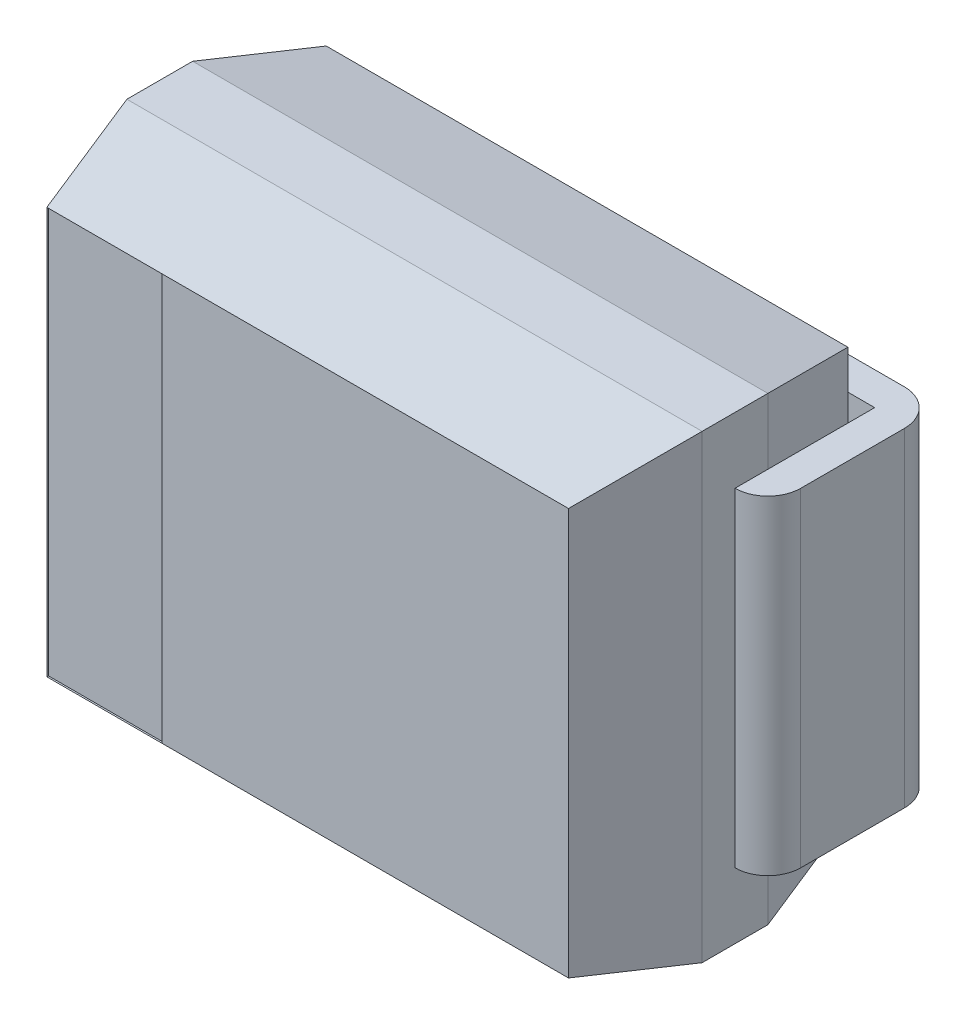
ISO-10303-21;
HEADER;
FILE_DESCRIPTION(('STEP AP214'),'2;1');
FILE_NAME('part.step','',(''),(''),'','','');
FILE_SCHEMA(('AUTOMOTIVE_DESIGN { 1 0 10303 214 1 1 1 1 }'));
ENDSEC;
DATA;
#1=APPLICATION_CONTEXT('core data for automotive mechanical design processes');
#2=APPLICATION_PROTOCOL_DEFINITION('international standard','automotive_design',2000,#1);
#3=PRODUCT_CONTEXT('',#1,'mechanical');
#4=PRODUCT('Part','Part','',(#3));
#5=PRODUCT_RELATED_PRODUCT_CATEGORY('part','',(#4));
#6=PRODUCT_DEFINITION_FORMATION('','',#4);
#7=PRODUCT_DEFINITION_CONTEXT('part definition',#1,'design');
#8=PRODUCT_DEFINITION('design','',#6,#7);
#9=PRODUCT_DEFINITION_SHAPE('','',#8);
#10=(LENGTH_UNIT() NAMED_UNIT(*) SI_UNIT(.MILLI.,.METRE.));
#11=(NAMED_UNIT(*) PLANE_ANGLE_UNIT() SI_UNIT($,.RADIAN.));
#12=(NAMED_UNIT(*) SI_UNIT($,.STERADIAN.) SOLID_ANGLE_UNIT());
#13=UNCERTAINTY_MEASURE_WITH_UNIT(LENGTH_MEASURE(1.E-05),#10,'distance_accuracy_value','');
#14=(GEOMETRIC_REPRESENTATION_CONTEXT(3) GLOBAL_UNCERTAINTY_ASSIGNED_CONTEXT((#13)) GLOBAL_UNIT_ASSIGNED_CONTEXT((#10,
#11,#12)) REPRESENTATION_CONTEXT('',''));
#15=CARTESIAN_POINT('',(0.,0.,0.));
#16=DIRECTION('',(0.,0.,1.));
#17=DIRECTION('',(1.,0.,0.));
#18=AXIS2_PLACEMENT_3D('',#15,#16,#17);
#19=CARTESIAN_POINT('',(0.815,-1.,0.));
#20=DIRECTION('',(-1.,0.,0.));
#21=DIRECTION('',(0.,0.,-1.));
#22=AXIS2_PLACEMENT_3D('',#19,#20,#21);
#23=PLANE('',#22);
#24=DIRECTION('',(0.,1.,0.));
#25=VECTOR('',#24,1.);
#26=CARTESIAN_POINT('',(0.815,-1.,0.));
#27=LINE('',#26,#25);
#28=CARTESIAN_POINT('',(0.815,-1.,0.));
#29=VERTEX_POINT('',#28);
#30=CARTESIAN_POINT('',(0.815,1.,0.));
#31=VERTEX_POINT('',#30);
#32=EDGE_CURVE('E51',#29,#31,#27,.T.);
#33=ORIENTED_EDGE('',*,*,#32,.F.);
#34=DIRECTION('',(0.,0.,-1.));
#35=VECTOR('',#34,1.);
#36=CARTESIAN_POINT('',(0.815,-1.,0.));
#37=LINE('',#36,#35);
#38=CARTESIAN_POINT('',(0.815,-1.,0.2));
#39=VERTEX_POINT('',#38);
#40=EDGE_CURVE('E164',#39,#29,#37,.T.);
#41=ORIENTED_EDGE('',*,*,#40,.F.);
#42=DIRECTION('',(0.,1.,0.));
#43=VECTOR('',#42,1.);
#44=CARTESIAN_POINT('',(0.815,-1.,0.2));
#45=LINE('',#44,#43);
#46=CARTESIAN_POINT('',(0.815,1.,0.2));
#47=VERTEX_POINT('',#46);
#48=EDGE_CURVE('E12',#39,#47,#45,.T.);
#49=ORIENTED_EDGE('',*,*,#48,.T.);
#50=DIRECTION('',(0.,0.,-1.));
#51=VECTOR('',#50,1.);
#52=CARTESIAN_POINT('',(0.815,1.,0.));
#53=LINE('',#52,#51);
#54=EDGE_CURVE('E112',#47,#31,#53,.T.);
#55=ORIENTED_EDGE('',*,*,#54,.T.);
#56=EDGE_LOOP('',(#33,#41,#49,#55));
#57=FACE_BOUND('',#56,.T.);
#58=ADVANCED_FACE('F48',(#57),#23,.T.);
#59=CARTESIAN_POINT('',(0.815,-1.,0.2));
#60=DIRECTION('',(0.,0.,1.));
#61=DIRECTION('',(-1.,0.,0.));
#62=AXIS2_PLACEMENT_3D('',#59,#60,#61);
#63=PLANE('',#62);
#64=ORIENTED_EDGE('',*,*,#48,.F.);
#65=DIRECTION('',(-1.,0.,0.));
#66=VECTOR('',#65,1.);
#67=CARTESIAN_POINT('',(0.815,-1.,0.2));
#68=LINE('',#67,#66);
#69=CARTESIAN_POINT('',(1.75,-1.,0.2));
#70=VERTEX_POINT('',#69);
#71=EDGE_CURVE('E64',#70,#39,#68,.T.);
#72=ORIENTED_EDGE('',*,*,#71,.F.);
#73=DIRECTION('',(0.,1.,0.));
#74=VECTOR('',#73,1.);
#75=CARTESIAN_POINT('',(1.75,-1.,0.2));
#76=LINE('',#75,#74);
#77=CARTESIAN_POINT('',(1.75,1.,0.2));
#78=VERTEX_POINT('',#77);
#79=EDGE_CURVE('E56',#70,#78,#76,.T.);
#80=ORIENTED_EDGE('',*,*,#79,.T.);
#81=DIRECTION('',(-1.,0.,0.));
#82=VECTOR('',#81,1.);
#83=CARTESIAN_POINT('',(0.815,1.,0.2));
#84=LINE('',#83,#82);
#85=EDGE_CURVE('E162',#78,#47,#84,.T.);
#86=ORIENTED_EDGE('',*,*,#85,.T.);
#87=EDGE_LOOP('',(#64,#72,#80,#86));
#88=FACE_BOUND('',#87,.T.);
#89=ADVANCED_FACE('F176',(#88),#63,.T.);
#90=CARTESIAN_POINT('',(1.75,-1.,0.2));
#91=DIRECTION('',(-1.,0.,0.));
#92=DIRECTION('',(0.,0.,-1.));
#93=AXIS2_PLACEMENT_3D('',#90,#91,#92);
#94=PLANE('',#93);
#95=ORIENTED_EDGE('',*,*,#79,.F.);
#96=DIRECTION('',(0.,0.,-1.));
#97=VECTOR('',#96,1.);
#98=CARTESIAN_POINT('',(1.75,-1.,0.850000000000009));
#99=LINE('',#98,#97);
#100=CARTESIAN_POINT('',(1.75,-1.,1.05000000000001));
#101=VERTEX_POINT('',#100);
#102=EDGE_CURVE('E69',#101,#70,#99,.T.);
#103=ORIENTED_EDGE('',*,*,#102,.F.);
#104=DIRECTION('',(0.,1.,0.));
#105=VECTOR('',#104,1.);
#106=CARTESIAN_POINT('',(1.75,-1.,1.05000000000001));
#107=LINE('',#106,#105);
#108=CARTESIAN_POINT('',(1.75,1.,1.05000000000001));
#109=VERTEX_POINT('',#108);
#110=EDGE_CURVE('E135',#101,#109,#107,.T.);
#111=ORIENTED_EDGE('',*,*,#110,.T.);
#112=DIRECTION('',(0.,0.,-1.));
#113=VECTOR('',#112,1.);
#114=CARTESIAN_POINT('',(1.75,1.,0.850000000000009));
#115=LINE('',#114,#113);
#116=EDGE_CURVE('E158',#109,#78,#115,.T.);
#117=ORIENTED_EDGE('',*,*,#116,.T.);
#118=EDGE_LOOP('',(#95,#103,#111,#117));
#119=FACE_BOUND('',#118,.T.);
#120=ADVANCED_FACE('F174',(#119),#94,.T.);
#121=CARTESIAN_POINT('',(1.75,-1.,0.850000000000009));
#122=DIRECTION('',(0.,1.,0.));
#123=DIRECTION('',(0.,0.,1.));
#124=AXIS2_PLACEMENT_3D('',#121,#122,#123);
#125=CYLINDRICAL_SURFACE('',#124,0.2);
#126=ORIENTED_EDGE('',*,*,#110,.F.);
#127=CARTESIAN_POINT('',(1.75,-1.,0.850000000000009));
#128=DIRECTION('',(0.,-1.,0.));
#129=DIRECTION('',(0.,0.,-1.));
#130=AXIS2_PLACEMENT_3D('',#127,#128,#129);
#131=CIRCLE('',#130,0.2);
#132=CARTESIAN_POINT('',(1.95,-1.,0.850000000000009));
#133=VERTEX_POINT('',#132);
#134=EDGE_CURVE('E129',#133,#101,#131,.T.);
#135=ORIENTED_EDGE('',*,*,#134,.F.);
#136=DIRECTION('',(0.,1.,0.));
#137=VECTOR('',#136,1.);
#138=CARTESIAN_POINT('',(1.95,-1.,0.850000000000009));
#139=LINE('',#138,#137);
#140=CARTESIAN_POINT('',(1.95,1.,0.850000000000009));
#141=VERTEX_POINT('',#140);
#142=EDGE_CURVE('E138',#133,#141,#139,.T.);
#143=ORIENTED_EDGE('',*,*,#142,.T.);
#144=CARTESIAN_POINT('',(1.75,1.,0.850000000000009));
#145=DIRECTION('',(0.,-1.,0.));
#146=DIRECTION('',(0.,0.,-1.));
#147=AXIS2_PLACEMENT_3D('',#144,#145,#146);
#148=CIRCLE('',#147,0.2);
#149=EDGE_CURVE('E156',#141,#109,#148,.T.);
#150=ORIENTED_EDGE('',*,*,#149,.T.);
#151=EDGE_LOOP('',(#126,#135,#143,#150));
#152=FACE_BOUND('',#151,.T.);
#153=ADVANCED_FACE('F172',(#152),#125,.T.);
#154=CARTESIAN_POINT('',(1.95,-1.,0.850000000000009));
#155=DIRECTION('',(1.,0.,0.));
#156=DIRECTION('',(0.,0.,1.));
#157=AXIS2_PLACEMENT_3D('',#154,#155,#156);
#158=PLANE('',#157);
#159=ORIENTED_EDGE('',*,*,#142,.F.);
#160=DIRECTION('',(0.,0.,1.));
#161=VECTOR('',#160,1.);
#162=CARTESIAN_POINT('',(1.95,-1.,0.850000000000009));
#163=LINE('',#162,#161);
#164=CARTESIAN_POINT('',(1.95,-1.,0.22));
#165=VERTEX_POINT('',#164);
#166=EDGE_CURVE('E149',#165,#133,#163,.T.);
#167=ORIENTED_EDGE('',*,*,#166,.F.);
#168=DIRECTION('',(0.,1.,0.));
#169=VECTOR('',#168,1.);
#170=CARTESIAN_POINT('',(1.95,-1.,0.22));
#171=LINE('',#170,#169);
#172=CARTESIAN_POINT('',(1.95,1.,0.22));
#173=VERTEX_POINT('',#172);
#174=EDGE_CURVE('E127',#165,#173,#171,.T.);
#175=ORIENTED_EDGE('',*,*,#174,.T.);
#176=DIRECTION('',(0.,0.,1.));
#177=VECTOR('',#176,1.);
#178=CARTESIAN_POINT('',(1.95,1.,0.850000000000009));
#179=LINE('',#178,#177);
#180=EDGE_CURVE('E147',#173,#141,#179,.T.);
#181=ORIENTED_EDGE('',*,*,#180,.T.);
#182=EDGE_LOOP('',(#159,#167,#175,#181));
#183=FACE_BOUND('',#182,.T.);
#184=ADVANCED_FACE('F146',(#183),#158,.T.);
#185=CARTESIAN_POINT('',(1.73,-1.,0.22));
#186=DIRECTION('',(0.,1.,0.));
#187=DIRECTION('',(0.,0.,1.));
#188=AXIS2_PLACEMENT_3D('',#185,#186,#187);
#189=CYLINDRICAL_SURFACE('',#188,0.22);
#190=ORIENTED_EDGE('',*,*,#174,.F.);
#191=CARTESIAN_POINT('',(1.73,-1.,0.22));
#192=DIRECTION('',(0.,-1.,0.));
#193=DIRECTION('',(0.,0.,1.));
#194=AXIS2_PLACEMENT_3D('',#191,#192,#193);
#195=CIRCLE('',#194,0.22);
#196=CARTESIAN_POINT('',(1.73,-1.,0.));
#197=VERTEX_POINT('',#196);
#198=EDGE_CURVE('E153',#197,#165,#195,.T.);
#199=ORIENTED_EDGE('',*,*,#198,.F.);
#200=DIRECTION('',(0.,1.,0.));
#201=VECTOR('',#200,1.);
#202=CARTESIAN_POINT('',(1.73,-1.,0.));
#203=LINE('',#202,#201);
#204=CARTESIAN_POINT('',(1.73,1.,0.));
#205=VERTEX_POINT('',#204);
#206=EDGE_CURVE('E126',#197,#205,#203,.T.);
#207=ORIENTED_EDGE('',*,*,#206,.T.);
#208=CARTESIAN_POINT('',(1.73,1.,0.22));
#209=DIRECTION('',(0.,-1.,0.));
#210=DIRECTION('',(0.,0.,1.));
#211=AXIS2_PLACEMENT_3D('',#208,#209,#210);
#212=CIRCLE('',#211,0.22);
#213=EDGE_CURVE('E114',#205,#173,#212,.T.);
#214=ORIENTED_EDGE('',*,*,#213,.T.);
#215=EDGE_LOOP('',(#190,#199,#207,#214));
#216=FACE_BOUND('',#215,.T.);
#217=ADVANCED_FACE('F152',(#216),#189,.T.);
#218=CARTESIAN_POINT('',(0.815,-1.,0.));
#219=DIRECTION('',(0.,0.,-1.));
#220=DIRECTION('',(1.,0.,0.));
#221=AXIS2_PLACEMENT_3D('',#218,#219,#220);
#222=PLANE('',#221);
#223=ORIENTED_EDGE('',*,*,#206,.F.);
#224=DIRECTION('',(1.,0.,0.));
#225=VECTOR('',#224,1.);
#226=CARTESIAN_POINT('',(0.815,-1.,0.));
#227=LINE('',#226,#225);
#228=EDGE_CURVE('E125',#29,#197,#227,.T.);
#229=ORIENTED_EDGE('',*,*,#228,.F.);
#230=ORIENTED_EDGE('',*,*,#32,.T.);
#231=DIRECTION('',(1.,0.,0.));
#232=VECTOR('',#231,1.);
#233=CARTESIAN_POINT('',(0.815,1.,0.));
#234=LINE('',#233,#232);
#235=EDGE_CURVE('E108',#31,#205,#234,.T.);
#236=ORIENTED_EDGE('',*,*,#235,.T.);
#237=EDGE_LOOP('',(#223,#229,#230,#236));
#238=FACE_BOUND('',#237,.T.);
#239=ADVANCED_FACE('F124',(#238),#222,.T.);
#240=CARTESIAN_POINT('',(1.75,-1.,0.850000000000009));
#241=DIRECTION('',(0.,-1.,0.));
#242=DIRECTION('',(0.,0.,-1.));
#243=AXIS2_PLACEMENT_3D('',#240,#241,#242);
#244=PLANE('',#243);
#245=ORIENTED_EDGE('',*,*,#40,.T.);
#246=ORIENTED_EDGE('',*,*,#228,.T.);
#247=ORIENTED_EDGE('',*,*,#198,.T.);
#248=ORIENTED_EDGE('',*,*,#166,.T.);
#249=ORIENTED_EDGE('',*,*,#134,.T.);
#250=ORIENTED_EDGE('',*,*,#102,.T.);
#251=ORIENTED_EDGE('',*,*,#71,.T.);
#252=EDGE_LOOP('',(#245,#246,#247,#248,#249,#250,#251));
#253=FACE_BOUND('',#252,.T.);
#254=ADVANCED_FACE('F170',(#253),#244,.T.);
#255=CARTESIAN_POINT('',(1.75,1.,0.850000000000009));
#256=DIRECTION('',(0.,-1.,0.));
#257=DIRECTION('',(0.,0.,-1.));
#258=AXIS2_PLACEMENT_3D('',#255,#256,#257);
#259=PLANE('',#258);
#260=ORIENTED_EDGE('',*,*,#54,.F.);
#261=ORIENTED_EDGE('',*,*,#85,.F.);
#262=ORIENTED_EDGE('',*,*,#116,.F.);
#263=ORIENTED_EDGE('',*,*,#149,.F.);
#264=ORIENTED_EDGE('',*,*,#180,.F.);
#265=ORIENTED_EDGE('',*,*,#213,.F.);
#266=ORIENTED_EDGE('',*,*,#235,.F.);
#267=EDGE_LOOP('',(#260,#261,#262,#263,#264,#265,#266));
#268=FACE_BOUND('',#267,.T.);
#269=ADVANCED_FACE('F110',(#268),#259,.F.);
#270=CLOSED_SHELL('',(#58,#89,#120,#153,#184,#217,#239,#254,#269));
#271=MANIFOLD_SOLID_BREP('B2',#270);
#272=CARTESIAN_POINT('',(-0.815,-1.,0.));
#273=DIRECTION('',(1.,0.,0.));
#274=DIRECTION('',(0.,0.,-1.));
#275=AXIS2_PLACEMENT_3D('',#272,#273,#274);
#276=PLANE('',#275);
#277=DIRECTION('',(0.,1.,0.));
#278=VECTOR('',#277,1.);
#279=CARTESIAN_POINT('',(-0.815,-1.,0.));
#280=LINE('',#279,#278);
#281=CARTESIAN_POINT('',(-0.815,-1.,0.));
#282=VERTEX_POINT('',#281);
#283=CARTESIAN_POINT('',(-0.815,1.,0.));
#284=VERTEX_POINT('',#283);
#285=EDGE_CURVE('E283',#282,#284,#280,.T.);
#286=ORIENTED_EDGE('',*,*,#285,.T.);
#287=DIRECTION('',(0.,0.,-1.));
#288=VECTOR('',#287,1.);
#289=CARTESIAN_POINT('',(-0.815,1.,0.));
#290=LINE('',#289,#288);
#291=CARTESIAN_POINT('',(-0.815,1.,0.2));
#292=VERTEX_POINT('',#291);
#293=EDGE_CURVE('E338',#292,#284,#290,.T.);
#294=ORIENTED_EDGE('',*,*,#293,.F.);
#295=DIRECTION('',(0.,1.,0.));
#296=VECTOR('',#295,1.);
#297=CARTESIAN_POINT('',(-0.815,-1.,0.2));
#298=LINE('',#297,#296);
#299=CARTESIAN_POINT('',(-0.815,-1.,0.2));
#300=VERTEX_POINT('',#299);
#301=EDGE_CURVE('E46',#300,#292,#298,.T.);
#302=ORIENTED_EDGE('',*,*,#301,.F.);
#303=DIRECTION('',(0.,0.,-1.));
#304=VECTOR('',#303,1.);
#305=CARTESIAN_POINT('',(-0.815,-1.,0.));
#306=LINE('',#305,#304);
#307=EDGE_CURVE('E339',#300,#282,#306,.T.);
#308=ORIENTED_EDGE('',*,*,#307,.T.);
#309=EDGE_LOOP('',(#286,#294,#302,#308));
#310=FACE_BOUND('',#309,.T.);
#311=ADVANCED_FACE('F280',(#310),#276,.T.);
#312=CARTESIAN_POINT('',(-0.815,-1.,0.2));
#313=DIRECTION('',(0.,0.,1.));
#314=DIRECTION('',(1.,0.,0.));
#315=AXIS2_PLACEMENT_3D('',#312,#313,#314);
#316=PLANE('',#315);
#317=ORIENTED_EDGE('',*,*,#301,.T.);
#318=DIRECTION('',(1.,0.,0.));
#319=VECTOR('',#318,1.);
#320=CARTESIAN_POINT('',(-0.815,1.,0.2));
#321=LINE('',#320,#319);
#322=CARTESIAN_POINT('',(-1.75,1.,0.2));
#323=VERTEX_POINT('',#322);
#324=EDGE_CURVE('E357',#323,#292,#321,.T.);
#325=ORIENTED_EDGE('',*,*,#324,.F.);
#326=DIRECTION('',(0.,1.,0.));
#327=VECTOR('',#326,1.);
#328=CARTESIAN_POINT('',(-1.75,-1.,0.2));
#329=LINE('',#328,#327);
#330=CARTESIAN_POINT('',(-1.75,-1.,0.2));
#331=VERTEX_POINT('',#330);
#332=EDGE_CURVE('E288',#331,#323,#329,.T.);
#333=ORIENTED_EDGE('',*,*,#332,.F.);
#334=DIRECTION('',(1.,0.,0.));
#335=VECTOR('',#334,1.);
#336=CARTESIAN_POINT('',(-0.815,-1.,0.2));
#337=LINE('',#336,#335);
#338=EDGE_CURVE('E344',#331,#300,#337,.T.);
#339=ORIENTED_EDGE('',*,*,#338,.T.);
#340=EDGE_LOOP('',(#317,#325,#333,#339));
#341=FACE_BOUND('',#340,.T.);
#342=ADVANCED_FACE('F406',(#341),#316,.T.);
#343=CARTESIAN_POINT('',(-1.75,-1.,0.2));
#344=DIRECTION('',(1.,0.,0.));
#345=DIRECTION('',(0.,0.,-1.));
#346=AXIS2_PLACEMENT_3D('',#343,#344,#345);
#347=PLANE('',#346);
#348=ORIENTED_EDGE('',*,*,#332,.T.);
#349=DIRECTION('',(0.,0.,-1.));
#350=VECTOR('',#349,1.);
#351=CARTESIAN_POINT('',(-1.75,1.,0.850000000000009));
#352=LINE('',#351,#350);
#353=CARTESIAN_POINT('',(-1.75,1.,1.05000000000001));
#354=VERTEX_POINT('',#353);
#355=EDGE_CURVE('E367',#354,#323,#352,.T.);
#356=ORIENTED_EDGE('',*,*,#355,.F.);
#357=DIRECTION('',(0.,1.,0.));
#358=VECTOR('',#357,1.);
#359=CARTESIAN_POINT('',(-1.75,-1.,1.05000000000001));
#360=LINE('',#359,#358);
#361=CARTESIAN_POINT('',(-1.75,-1.,1.05000000000001));
#362=VERTEX_POINT('',#361);
#363=EDGE_CURVE('E386',#362,#354,#360,.T.);
#364=ORIENTED_EDGE('',*,*,#363,.F.);
#365=DIRECTION('',(0.,0.,-1.));
#366=VECTOR('',#365,1.);
#367=CARTESIAN_POINT('',(-1.75,-1.,0.850000000000009));
#368=LINE('',#367,#366);
#369=EDGE_CURVE('E302',#362,#331,#368,.T.);
#370=ORIENTED_EDGE('',*,*,#369,.T.);
#371=EDGE_LOOP('',(#348,#356,#364,#370));
#372=FACE_BOUND('',#371,.T.);
#373=ADVANCED_FACE('F408',(#372),#347,.T.);
#374=CARTESIAN_POINT('',(-1.75,-1.,0.850000000000009));
#375=DIRECTION('',(0.,1.,0.));
#376=DIRECTION('',(0.,0.,1.));
#377=AXIS2_PLACEMENT_3D('',#374,#375,#376);
#378=CYLINDRICAL_SURFACE('',#377,0.2);
#379=ORIENTED_EDGE('',*,*,#363,.T.);
#380=CARTESIAN_POINT('',(-1.75,1.,0.850000000000009));
#381=DIRECTION('',(0.,1.,0.));
#382=DIRECTION('',(0.,0.,-1.));
#383=AXIS2_PLACEMENT_3D('',#380,#381,#382);
#384=CIRCLE('',#383,0.2);
#385=CARTESIAN_POINT('',(-1.95,1.,0.850000000000009));
#386=VERTEX_POINT('',#385);
#387=EDGE_CURVE('E364',#386,#354,#384,.T.);
#388=ORIENTED_EDGE('',*,*,#387,.F.);
#389=DIRECTION('',(0.,1.,0.));
#390=VECTOR('',#389,1.);
#391=CARTESIAN_POINT('',(-1.95,-1.,0.850000000000009));
#392=LINE('',#391,#390);
#393=CARTESIAN_POINT('',(-1.95,-1.,0.850000000000009));
#394=VERTEX_POINT('',#393);
#395=EDGE_CURVE('E388',#394,#386,#392,.T.);
#396=ORIENTED_EDGE('',*,*,#395,.F.);
#397=CARTESIAN_POINT('',(-1.75,-1.,0.850000000000009));
#398=DIRECTION('',(0.,1.,0.));
#399=DIRECTION('',(0.,0.,-1.));
#400=AXIS2_PLACEMENT_3D('',#397,#398,#399);
#401=CIRCLE('',#400,0.2);
#402=EDGE_CURVE('E379',#394,#362,#401,.T.);
#403=ORIENTED_EDGE('',*,*,#402,.T.);
#404=EDGE_LOOP('',(#379,#388,#396,#403));
#405=FACE_BOUND('',#404,.T.);
#406=ADVANCED_FACE('F401',(#405),#378,.T.);
#407=CARTESIAN_POINT('',(-1.95,-1.,0.850000000000009));
#408=DIRECTION('',(-1.,0.,0.));
#409=DIRECTION('',(0.,0.,1.));
#410=AXIS2_PLACEMENT_3D('',#407,#408,#409);
#411=PLANE('',#410);
#412=ORIENTED_EDGE('',*,*,#395,.T.);
#413=DIRECTION('',(0.,0.,1.));
#414=VECTOR('',#413,1.);
#415=CARTESIAN_POINT('',(-1.95,1.,0.850000000000009));
#416=LINE('',#415,#414);
#417=CARTESIAN_POINT('',(-1.95,1.,0.22));
#418=VERTEX_POINT('',#417);
#419=EDGE_CURVE('E361',#418,#386,#416,.T.);
#420=ORIENTED_EDGE('',*,*,#419,.F.);
#421=DIRECTION('',(0.,1.,0.));
#422=VECTOR('',#421,1.);
#423=CARTESIAN_POINT('',(-1.95,-1.,0.22));
#424=LINE('',#423,#422);
#425=CARTESIAN_POINT('',(-1.95,-1.,0.22));
#426=VERTEX_POINT('',#425);
#427=EDGE_CURVE('E390',#426,#418,#424,.T.);
#428=ORIENTED_EDGE('',*,*,#427,.F.);
#429=DIRECTION('',(0.,0.,1.));
#430=VECTOR('',#429,1.);
#431=CARTESIAN_POINT('',(-1.95,-1.,0.850000000000009));
#432=LINE('',#431,#430);
#433=EDGE_CURVE('E376',#426,#394,#432,.T.);
#434=ORIENTED_EDGE('',*,*,#433,.T.);
#435=EDGE_LOOP('',(#412,#420,#428,#434));
#436=FACE_BOUND('',#435,.T.);
#437=ADVANCED_FACE('F398',(#436),#411,.T.);
#438=CARTESIAN_POINT('',(-1.73,-1.,0.22));
#439=DIRECTION('',(0.,1.,0.));
#440=DIRECTION('',(0.,0.,1.));
#441=AXIS2_PLACEMENT_3D('',#438,#439,#440);
#442=CYLINDRICAL_SURFACE('',#441,0.22);
#443=ORIENTED_EDGE('',*,*,#427,.T.);
#444=CARTESIAN_POINT('',(-1.73,1.,0.22));
#445=DIRECTION('',(0.,1.,0.));
#446=DIRECTION('',(0.,0.,1.));
#447=AXIS2_PLACEMENT_3D('',#444,#445,#446);
#448=CIRCLE('',#447,0.22);
#449=CARTESIAN_POINT('',(-1.73,1.,0.));
#450=VERTEX_POINT('',#449);
#451=EDGE_CURVE('E351',#450,#418,#448,.T.);
#452=ORIENTED_EDGE('',*,*,#451,.F.);
#453=DIRECTION('',(0.,1.,0.));
#454=VECTOR('',#453,1.);
#455=CARTESIAN_POINT('',(-1.73,-1.,0.));
#456=LINE('',#455,#454);
#457=CARTESIAN_POINT('',(-1.73,-1.,0.));
#458=VERTEX_POINT('',#457);
#459=EDGE_CURVE('E343',#458,#450,#456,.T.);
#460=ORIENTED_EDGE('',*,*,#459,.F.);
#461=CARTESIAN_POINT('',(-1.73,-1.,0.22));
#462=DIRECTION('',(0.,1.,0.));
#463=DIRECTION('',(0.,0.,1.));
#464=AXIS2_PLACEMENT_3D('',#461,#462,#463);
#465=CIRCLE('',#464,0.22);
#466=EDGE_CURVE('E373',#458,#426,#465,.T.);
#467=ORIENTED_EDGE('',*,*,#466,.T.);
#468=EDGE_LOOP('',(#443,#452,#460,#467));
#469=FACE_BOUND('',#468,.T.);
#470=ADVANCED_FACE('F392',(#469),#442,.T.);
#471=CARTESIAN_POINT('',(-0.815,-1.,0.));
#472=DIRECTION('',(0.,0.,-1.));
#473=DIRECTION('',(-1.,0.,0.));
#474=AXIS2_PLACEMENT_3D('',#471,#472,#473);
#475=PLANE('',#474);
#476=ORIENTED_EDGE('',*,*,#459,.T.);
#477=DIRECTION('',(-1.,0.,0.));
#478=VECTOR('',#477,1.);
#479=CARTESIAN_POINT('',(-0.815,1.,0.));
#480=LINE('',#479,#478);
#481=EDGE_CURVE('E346',#284,#450,#480,.T.);
#482=ORIENTED_EDGE('',*,*,#481,.F.);
#483=ORIENTED_EDGE('',*,*,#285,.F.);
#484=DIRECTION('',(-1.,0.,0.));
#485=VECTOR('',#484,1.);
#486=CARTESIAN_POINT('',(-0.815,-1.,0.));
#487=LINE('',#486,#485);
#488=EDGE_CURVE('E371',#282,#458,#487,.T.);
#489=ORIENTED_EDGE('',*,*,#488,.T.);
#490=EDGE_LOOP('',(#476,#482,#483,#489));
#491=FACE_BOUND('',#490,.T.);
#492=ADVANCED_FACE('F347',(#491),#475,.T.);
#493=CARTESIAN_POINT('',(-1.75,-1.,0.850000000000009));
#494=DIRECTION('',(0.,-1.,0.));
#495=DIRECTION('',(0.,0.,-1.));
#496=AXIS2_PLACEMENT_3D('',#493,#494,#495);
#497=PLANE('',#496);
#498=ORIENTED_EDGE('',*,*,#307,.F.);
#499=ORIENTED_EDGE('',*,*,#338,.F.);
#500=ORIENTED_EDGE('',*,*,#369,.F.);
#501=ORIENTED_EDGE('',*,*,#402,.F.);
#502=ORIENTED_EDGE('',*,*,#433,.F.);
#503=ORIENTED_EDGE('',*,*,#466,.F.);
#504=ORIENTED_EDGE('',*,*,#488,.F.);
#505=EDGE_LOOP('',(#498,#499,#500,#501,#502,#503,#504));
#506=FACE_BOUND('',#505,.T.);
#507=ADVANCED_FACE('F403',(#506),#497,.T.);
#508=CARTESIAN_POINT('',(-1.75,1.,0.850000000000009));
#509=DIRECTION('',(0.,-1.,0.));
#510=DIRECTION('',(0.,0.,-1.));
#511=AXIS2_PLACEMENT_3D('',#508,#509,#510);
#512=PLANE('',#511);
#513=ORIENTED_EDGE('',*,*,#293,.T.);
#514=ORIENTED_EDGE('',*,*,#481,.T.);
#515=ORIENTED_EDGE('',*,*,#451,.T.);
#516=ORIENTED_EDGE('',*,*,#419,.T.);
#517=ORIENTED_EDGE('',*,*,#387,.T.);
#518=ORIENTED_EDGE('',*,*,#355,.T.);
#519=ORIENTED_EDGE('',*,*,#324,.T.);
#520=EDGE_LOOP('',(#513,#514,#515,#516,#517,#518,#519));
#521=FACE_BOUND('',#520,.T.);
#522=ADVANCED_FACE('F354',(#521),#512,.F.);
#523=CLOSED_SHELL('',(#311,#342,#373,#406,#437,#470,#492,#507,#522));
#524=MANIFOLD_SOLID_BREP('B6',#523);
#525=CARTESIAN_POINT('',(1.75,1.4,1.9));
#526=DIRECTION('',(-1.,0.,0.));
#527=DIRECTION('',(0.,-1.,0.));
#528=AXIS2_PLACEMENT_3D('',#525,#526,#527);
#529=PLANE('',#528);
#530=DIRECTION('',(0.,0.,-1.));
#531=VECTOR('',#530,1.);
#532=CARTESIAN_POINT('',(1.75,-1.4,1.9));
#533=LINE('',#532,#531);
#534=CARTESIAN_POINT('',(1.75,-1.4,1.24999999999999));
#535=VERTEX_POINT('',#534);
#536=CARTESIAN_POINT('',(1.75,-1.4,0.850000000000009));
#537=VERTEX_POINT('',#536);
#538=EDGE_CURVE('E608',#535,#537,#533,.T.);
#539=ORIENTED_EDGE('',*,*,#538,.T.);
#540=DIRECTION('',(0.,1.,0.));
#541=VECTOR('',#540,1.);
#542=CARTESIAN_POINT('',(1.75,1.4,0.850000000000009));
#543=LINE('',#542,#541);
#544=CARTESIAN_POINT('',(1.75,1.4,0.850000000000009));
#545=VERTEX_POINT('',#544);
#546=EDGE_CURVE('E637',#537,#545,#543,.T.);
#547=ORIENTED_EDGE('',*,*,#546,.T.);
#548=DIRECTION('',(0.,0.,-1.));
#549=VECTOR('',#548,1.);
#550=CARTESIAN_POINT('',(1.75,1.4,1.9));
#551=LINE('',#550,#549);
#552=CARTESIAN_POINT('',(1.75,1.4,1.24999999999999));
#553=VERTEX_POINT('',#552);
#554=EDGE_CURVE('E616',#553,#545,#551,.T.);
#555=ORIENTED_EDGE('',*,*,#554,.F.);
#556=DIRECTION('',(0.,-1.,0.));
#557=VECTOR('',#556,1.);
#558=CARTESIAN_POINT('',(1.75,-1.4,1.24999999999999));
#559=LINE('',#558,#557);
#560=EDGE_CURVE('E631',#553,#535,#559,.T.);
#561=ORIENTED_EDGE('',*,*,#560,.T.);
#562=EDGE_LOOP('',(#539,#547,#555,#561));
#563=FACE_BOUND('',#562,.T.);
#564=ADVANCED_FACE('F485',(#563),#529,.F.);
#565=CARTESIAN_POINT('',(-1.75,1.4,1.9));
#566=DIRECTION('',(0.,-1.,0.));
#567=DIRECTION('',(0.,0.,-1.));
#568=AXIS2_PLACEMENT_3D('',#565,#566,#567);
#569=PLANE('',#568);
#570=ORIENTED_EDGE('',*,*,#554,.T.);
#571=DIRECTION('',(-1.,0.,0.));
#572=VECTOR('',#571,1.);
#573=CARTESIAN_POINT('',(-1.75,1.4,0.850000000000009));
#574=LINE('',#573,#572);
#575=CARTESIAN_POINT('',(-1.75,1.4,0.850000000000009));
#576=VERTEX_POINT('',#575);
#577=EDGE_CURVE('E659',#545,#576,#574,.T.);
#578=ORIENTED_EDGE('',*,*,#577,.T.);
#579=DIRECTION('',(0.,0.,-1.));
#580=VECTOR('',#579,1.);
#581=CARTESIAN_POINT('',(-1.75,1.4,1.9));
#582=LINE('',#581,#580);
#583=CARTESIAN_POINT('',(-1.75,1.4,1.24999999999999));
#584=VERTEX_POINT('',#583);
#585=EDGE_CURVE('E614',#584,#576,#582,.T.);
#586=ORIENTED_EDGE('',*,*,#585,.F.);
#587=DIRECTION('',(1.,0.,0.));
#588=VECTOR('',#587,1.);
#589=CARTESIAN_POINT('',(1.75,1.4,1.24999999999999));
#590=LINE('',#589,#588);
#591=EDGE_CURVE('E628',#584,#553,#590,.T.);
#592=ORIENTED_EDGE('',*,*,#591,.T.);
#593=EDGE_LOOP('',(#570,#578,#586,#592));
#594=FACE_BOUND('',#593,.T.);
#595=ADVANCED_FACE('F692',(#594),#569,.F.);
#596=CARTESIAN_POINT('',(-1.75,1.4,1.9));
#597=DIRECTION('',(1.,0.,0.));
#598=DIRECTION('',(0.,1.,0.));
#599=AXIS2_PLACEMENT_3D('',#596,#597,#598);
#600=PLANE('',#599);
#601=ORIENTED_EDGE('',*,*,#585,.T.);
#602=DIRECTION('',(0.,-1.,0.));
#603=VECTOR('',#602,1.);
#604=CARTESIAN_POINT('',(-1.75,1.4,0.850000000000009));
#605=LINE('',#604,#603);
#606=CARTESIAN_POINT('',(-1.75,-1.4,0.850000000000009));
#607=VERTEX_POINT('',#606);
#608=EDGE_CURVE('E278',#576,#607,#605,.T.);
#609=ORIENTED_EDGE('',*,*,#608,.T.);
#610=DIRECTION('',(0.,0.,-1.));
#611=VECTOR('',#610,1.);
#612=CARTESIAN_POINT('',(-1.75,-1.4,1.9));
#613=LINE('',#612,#611);
#614=CARTESIAN_POINT('',(-1.75,-1.4,1.24999999999999));
#615=VERTEX_POINT('',#614);
#616=EDGE_CURVE('E611',#615,#607,#613,.T.);
#617=ORIENTED_EDGE('',*,*,#616,.F.);
#618=DIRECTION('',(0.,1.,0.));
#619=VECTOR('',#618,1.);
#620=CARTESIAN_POINT('',(-1.75,1.4,1.24999999999999));
#621=LINE('',#620,#619);
#622=EDGE_CURVE('E635',#615,#584,#621,.T.);
#623=ORIENTED_EDGE('',*,*,#622,.T.);
#624=EDGE_LOOP('',(#601,#609,#617,#623));
#625=FACE_BOUND('',#624,.T.);
#626=ADVANCED_FACE('F729',(#625),#600,.F.);
#627=CARTESIAN_POINT('',(-1.75,-1.4,1.9));
#628=DIRECTION('',(0.,1.,0.));
#629=DIRECTION('',(0.,0.,1.));
#630=AXIS2_PLACEMENT_3D('',#627,#628,#629);
#631=PLANE('',#630);
#632=ORIENTED_EDGE('',*,*,#616,.T.);
#633=DIRECTION('',(1.,0.,0.));
#634=VECTOR('',#633,1.);
#635=CARTESIAN_POINT('',(-1.75,-1.4,0.850000000000009));
#636=LINE('',#635,#634);
#637=EDGE_CURVE('E494',#607,#537,#636,.T.);
#638=ORIENTED_EDGE('',*,*,#637,.T.);
#639=ORIENTED_EDGE('',*,*,#538,.F.);
#640=DIRECTION('',(-1.,0.,0.));
#641=VECTOR('',#640,1.);
#642=CARTESIAN_POINT('',(-1.75,-1.4,1.24999999999999));
#643=LINE('',#642,#641);
#644=EDGE_CURVE('E633',#535,#615,#643,.T.);
#645=ORIENTED_EDGE('',*,*,#644,.T.);
#646=EDGE_LOOP('',(#632,#638,#639,#645));
#647=FACE_BOUND('',#646,.T.);
#648=ADVANCED_FACE('F782',(#647),#631,.F.);
#649=CARTESIAN_POINT('',(0.,0.,1.9));
#650=DIRECTION('',(0.,0.,1.));
#651=DIRECTION('',(1.,0.,0.));
#652=AXIS2_PLACEMENT_3D('',#649,#650,#651);
#653=PLANE('',#652);
#654=DIRECTION('',(0.,1.,0.));
#655=VECTOR('',#654,1.);
#656=CARTESIAN_POINT('',(-0.887,-1.237,1.9));
#657=LINE('',#656,#655);
#658=CARTESIAN_POINT('',(-0.887,-1.237,1.9));
#659=VERTEX_POINT('',#658);
#660=CARTESIAN_POINT('',(-0.887,1.237,1.9));
#661=VERTEX_POINT('',#660);
#662=EDGE_CURVE('E502',#659,#661,#657,.T.);
#663=ORIENTED_EDGE('',*,*,#662,.F.);
#664=DIRECTION('',(1.,0.,0.));
#665=VECTOR('',#664,1.);
#666=CARTESIAN_POINT('',(1.75,-1.237,1.9));
#667=LINE('',#666,#665);
#668=CARTESIAN_POINT('',(1.587,-1.237,1.9));
#669=VERTEX_POINT('',#668);
#670=EDGE_CURVE('E620',#659,#669,#667,.T.);
#671=ORIENTED_EDGE('',*,*,#670,.T.);
#672=DIRECTION('',(0.,1.,0.));
#673=VECTOR('',#672,1.);
#674=CARTESIAN_POINT('',(1.587,1.4,1.9));
#675=LINE('',#674,#673);
#676=CARTESIAN_POINT('',(1.587,1.237,1.9));
#677=VERTEX_POINT('',#676);
#678=EDGE_CURVE('E623',#669,#677,#675,.T.);
#679=ORIENTED_EDGE('',*,*,#678,.T.);
#680=DIRECTION('',(-1.,0.,0.));
#681=VECTOR('',#680,1.);
#682=CARTESIAN_POINT('',(-1.75,1.237,1.9));
#683=LINE('',#682,#681);
#684=EDGE_CURVE('E625',#677,#661,#683,.T.);
#685=ORIENTED_EDGE('',*,*,#684,.T.);
#686=EDGE_LOOP('',(#663,#671,#679,#685));
#687=FACE_BOUND('',#686,.T.);
#688=ADVANCED_FACE('F711',(#687),#653,.T.);
#689=CARTESIAN_POINT('',(0.,0.,0.2));
#690=DIRECTION('',(0.,0.,1.));
#691=DIRECTION('',(1.,0.,0.));
#692=AXIS2_PLACEMENT_3D('',#689,#690,#691);
#693=PLANE('',#692);
#694=DIRECTION('',(1.,0.,0.));
#695=VECTOR('',#694,1.);
#696=CARTESIAN_POINT('',(0.,1.237,0.2));
#697=LINE('',#696,#695);
#698=CARTESIAN_POINT('',(-1.587,1.237,0.2));
#699=VERTEX_POINT('',#698);
#700=CARTESIAN_POINT('',(1.587,1.237,0.2));
#701=VERTEX_POINT('',#700);
#702=EDGE_CURVE('E654',#699,#701,#697,.T.);
#703=ORIENTED_EDGE('',*,*,#702,.T.);
#704=DIRECTION('',(0.,-1.,0.));
#705=VECTOR('',#704,1.);
#706=CARTESIAN_POINT('',(1.587,0.,0.2));
#707=LINE('',#706,#705);
#708=CARTESIAN_POINT('',(1.587,-1.237,0.2));
#709=VERTEX_POINT('',#708);
#710=EDGE_CURVE('E656',#701,#709,#707,.T.);
#711=ORIENTED_EDGE('',*,*,#710,.T.);
#712=DIRECTION('',(-1.,0.,0.));
#713=VECTOR('',#712,1.);
#714=CARTESIAN_POINT('',(0.,-1.237,0.2));
#715=LINE('',#714,#713);
#716=CARTESIAN_POINT('',(-1.587,-1.237,0.2));
#717=VERTEX_POINT('',#716);
#718=EDGE_CURVE('E652',#709,#717,#715,.T.);
#719=ORIENTED_EDGE('',*,*,#718,.T.);
#720=DIRECTION('',(0.,1.,0.));
#721=VECTOR('',#720,1.);
#722=CARTESIAN_POINT('',(-1.587,0.,0.2));
#723=LINE('',#722,#721);
#724=EDGE_CURVE('E650',#717,#699,#723,.T.);
#725=ORIENTED_EDGE('',*,*,#724,.T.);
#726=EDGE_LOOP('',(#703,#711,#719,#725));
#727=FACE_BOUND('',#726,.T.);
#728=ADVANCED_FACE('F680',(#727),#693,.F.);
#729=CARTESIAN_POINT('',(0.,-1.237,1.9));
#730=DIRECTION('',(0.,-0.969966686406199,0.243237799821859));
#731=DIRECTION('',(-1.,0.,0.));
#732=AXIS2_PLACEMENT_3D('',#729,#730,#731);
#733=PLANE('',#732);
#734=DIRECTION('',(0.236346585407371,0.236346585407371,0.942486383526337));
#735=VECTOR('',#734,1.);
#736=CARTESIAN_POINT('',(-1.51790154066748,-1.16790154066748,2.17554600347323));
#737=LINE('',#736,#735);
#738=CARTESIAN_POINT('',(-1.587,-1.237,1.9));
#739=VERTEX_POINT('',#738);
#740=EDGE_CURVE('E643',#615,#739,#737,.T.);
#741=ORIENTED_EDGE('',*,*,#740,.F.);
#742=ORIENTED_EDGE('',*,*,#644,.F.);
#743=DIRECTION('',(-0.236346585407371,0.236346585407371,0.942486383526337));
#744=VECTOR('',#743,1.);
#745=CARTESIAN_POINT('',(1.49835064271568,-1.14835064271568,2.25350970696201));
#746=LINE('',#745,#744);
#747=EDGE_CURVE('E612',#669,#535,#746,.F.);
#748=ORIENTED_EDGE('',*,*,#747,.F.);
#749=ORIENTED_EDGE('',*,*,#670,.F.);
#750=EDGE_CURVE('E621',#739,#659,#667,.T.);
#751=ORIENTED_EDGE('',*,*,#750,.F.);
#752=EDGE_LOOP('',(#741,#742,#748,#749,#751));
#753=FACE_BOUND('',#752,.T.);
#754=ADVANCED_FACE('F707',(#753),#733,.T.);
#755=CARTESIAN_POINT('',(1.587,0.,1.9));
#756=DIRECTION('',(0.969966686406199,0.,0.243237799821859));
#757=DIRECTION('',(0.,-1.,0.));
#758=AXIS2_PLACEMENT_3D('',#755,#756,#757);
#759=PLANE('',#758);
#760=ORIENTED_EDGE('',*,*,#747,.T.);
#761=ORIENTED_EDGE('',*,*,#560,.F.);
#762=DIRECTION('',(-0.236346585407371,-0.236346585407371,0.942486383526337));
#763=VECTOR('',#762,1.);
#764=CARTESIAN_POINT('',(1.51790154066748,1.16790154066748,2.17554600347323));
#765=LINE('',#764,#763);
#766=EDGE_CURVE('E641',#677,#553,#765,.F.);
#767=ORIENTED_EDGE('',*,*,#766,.F.);
#768=ORIENTED_EDGE('',*,*,#678,.F.);
#769=EDGE_LOOP('',(#760,#761,#767,#768));
#770=FACE_BOUND('',#769,.T.);
#771=ADVANCED_FACE('F737',(#770),#759,.T.);
#772=CARTESIAN_POINT('',(-1.587,0.,1.9));
#773=DIRECTION('',(-0.969966686406199,0.,0.243237799821859));
#774=DIRECTION('',(0.,1.,0.));
#775=AXIS2_PLACEMENT_3D('',#772,#773,#774);
#776=PLANE('',#775);
#777=ORIENTED_EDGE('',*,*,#740,.T.);
#778=DIRECTION('',(0.,-1.,0.));
#779=VECTOR('',#778,1.);
#780=CARTESIAN_POINT('',(-1.587,-1.4,1.9));
#781=LINE('',#780,#779);
#782=CARTESIAN_POINT('',(-1.587,1.237,1.9));
#783=VERTEX_POINT('',#782);
#784=EDGE_CURVE('E577',#783,#739,#781,.T.);
#785=ORIENTED_EDGE('',*,*,#784,.F.);
#786=DIRECTION('',(-0.236346585407371,0.236346585407371,-0.942486383526337));
#787=VECTOR('',#786,1.);
#788=CARTESIAN_POINT('',(-1.51790154066748,1.16790154066748,2.17554600347323));
#789=LINE('',#788,#787);
#790=EDGE_CURVE('E638',#584,#783,#789,.F.);
#791=ORIENTED_EDGE('',*,*,#790,.F.);
#792=ORIENTED_EDGE('',*,*,#622,.F.);
#793=EDGE_LOOP('',(#777,#785,#791,#792));
#794=FACE_BOUND('',#793,.T.);
#795=ADVANCED_FACE('F703',(#794),#776,.T.);
#796=CARTESIAN_POINT('',(0.,1.237,1.9));
#797=DIRECTION('',(0.,0.969966686406199,0.243237799821859));
#798=DIRECTION('',(1.,0.,0.));
#799=AXIS2_PLACEMENT_3D('',#796,#797,#798);
#800=PLANE('',#799);
#801=ORIENTED_EDGE('',*,*,#766,.T.);
#802=ORIENTED_EDGE('',*,*,#591,.F.);
#803=ORIENTED_EDGE('',*,*,#790,.T.);
#804=DIRECTION('',(-1.,0.,0.));
#805=VECTOR('',#804,1.);
#806=CARTESIAN_POINT('',(-1.587,1.237,1.9));
#807=LINE('',#806,#805);
#808=EDGE_CURVE('E594',#661,#783,#807,.T.);
#809=ORIENTED_EDGE('',*,*,#808,.F.);
#810=ORIENTED_EDGE('',*,*,#684,.F.);
#811=EDGE_LOOP('',(#801,#802,#803,#809,#810));
#812=FACE_BOUND('',#811,.T.);
#813=ADVANCED_FACE('F696',(#812),#800,.T.);
#814=CARTESIAN_POINT('',(-1.75,1.4,0.850000000000009));
#815=DIRECTION('',(0.969966686406199,0.,0.243237799821859));
#816=DIRECTION('',(0.,-1.,0.));
#817=AXIS2_PLACEMENT_3D('',#814,#815,#816);
#818=PLANE('',#817);
#819=DIRECTION('',(0.236346585407371,-0.236346585407371,-0.942486383526337));
#820=VECTOR('',#819,1.);
#821=CARTESIAN_POINT('',(-1.75,1.4,0.850000000000009));
#822=LINE('',#821,#820);
#823=EDGE_CURVE('E664',#699,#576,#822,.F.);
#824=ORIENTED_EDGE('',*,*,#823,.F.);
#825=ORIENTED_EDGE('',*,*,#724,.F.);
#826=DIRECTION('',(-0.236346585407371,-0.236346585407371,0.942486383526337));
#827=VECTOR('',#826,1.);
#828=CARTESIAN_POINT('',(-1.59359281638557,-1.24359281638557,0.226290372089714));
#829=LINE('',#828,#827);
#830=EDGE_CURVE('E489',#607,#717,#829,.F.);
#831=ORIENTED_EDGE('',*,*,#830,.F.);
#832=ORIENTED_EDGE('',*,*,#608,.F.);
#833=EDGE_LOOP('',(#824,#825,#831,#832));
#834=FACE_BOUND('',#833,.T.);
#835=ADVANCED_FACE('F487',(#834),#818,.F.);
#836=CARTESIAN_POINT('',(-1.75,-1.4,0.850000000000009));
#837=DIRECTION('',(0.,0.969966686406199,0.243237799821859));
#838=DIRECTION('',(1.,0.,0.));
#839=AXIS2_PLACEMENT_3D('',#836,#837,#838);
#840=PLANE('',#839);
#841=ORIENTED_EDGE('',*,*,#830,.T.);
#842=ORIENTED_EDGE('',*,*,#718,.F.);
#843=DIRECTION('',(0.236346585407371,-0.236346585407371,0.942486383526337));
#844=VECTOR('',#843,1.);
#845=CARTESIAN_POINT('',(1.55449102048197,-1.20449102048197,0.0703629651121396));
#846=LINE('',#845,#844);
#847=EDGE_CURVE('E663',#537,#709,#846,.F.);
#848=ORIENTED_EDGE('',*,*,#847,.F.);
#849=ORIENTED_EDGE('',*,*,#637,.F.);
#850=EDGE_LOOP('',(#841,#842,#848,#849));
#851=FACE_BOUND('',#850,.T.);
#852=ADVANCED_FACE('F675',(#851),#840,.F.);
#853=CARTESIAN_POINT('',(-1.75,1.4,0.850000000000009));
#854=DIRECTION('',(0.,-0.969966686406199,0.243237799821859));
#855=DIRECTION('',(-1.,0.,0.));
#856=AXIS2_PLACEMENT_3D('',#853,#854,#855);
#857=PLANE('',#856);
#858=ORIENTED_EDGE('',*,*,#823,.T.);
#859=ORIENTED_EDGE('',*,*,#577,.F.);
#860=DIRECTION('',(-0.236346585407371,-0.236346585407371,-0.942486383526337));
#861=VECTOR('',#860,1.);
#862=CARTESIAN_POINT('',(1.55449102048197,1.20449102048197,0.0703629651121399));
#863=LINE('',#862,#861);
#864=EDGE_CURVE('E604',#701,#545,#863,.F.);
#865=ORIENTED_EDGE('',*,*,#864,.F.);
#866=ORIENTED_EDGE('',*,*,#702,.F.);
#867=EDGE_LOOP('',(#858,#859,#865,#866));
#868=FACE_BOUND('',#867,.T.);
#869=ADVANCED_FACE('F686',(#868),#857,.F.);
#870=CARTESIAN_POINT('',(1.75,1.4,0.850000000000009));
#871=DIRECTION('',(-0.969966686406199,0.,0.243237799821859));
#872=DIRECTION('',(0.,1.,0.));
#873=AXIS2_PLACEMENT_3D('',#870,#871,#872);
#874=PLANE('',#873);
#875=ORIENTED_EDGE('',*,*,#847,.T.);
#876=ORIENTED_EDGE('',*,*,#710,.F.);
#877=ORIENTED_EDGE('',*,*,#864,.T.);
#878=ORIENTED_EDGE('',*,*,#546,.F.);
#879=EDGE_LOOP('',(#875,#876,#877,#878));
#880=FACE_BOUND('',#879,.T.);
#881=ADVANCED_FACE('F684',(#880),#874,.F.);
#882=CARTESIAN_POINT('',(-1.587,-1.237,1.89));
#883=DIRECTION('',(-1.,0.,0.));
#884=DIRECTION('',(0.,0.,1.));
#885=AXIS2_PLACEMENT_3D('',#882,#883,#884);
#886=PLANE('',#885);
#887=ORIENTED_EDGE('',*,*,#784,.T.);
#888=DIRECTION('',(0.,0.,1.));
#889=VECTOR('',#888,1.);
#890=CARTESIAN_POINT('',(-1.587,-1.237,1.89));
#891=LINE('',#890,#889);
#892=CARTESIAN_POINT('',(-1.587,-1.237,1.89));
#893=VERTEX_POINT('',#892);
#894=EDGE_CURVE('E570',#893,#739,#891,.T.);
#895=ORIENTED_EDGE('',*,*,#894,.F.);
#896=DIRECTION('',(0.,-1.,0.));
#897=VECTOR('',#896,1.);
#898=CARTESIAN_POINT('',(-1.587,-1.237,1.89));
#899=LINE('',#898,#897);
#900=CARTESIAN_POINT('',(-1.587,1.237,1.89));
#901=VERTEX_POINT('',#900);
#902=EDGE_CURVE('E574',#901,#893,#899,.T.);
#903=ORIENTED_EDGE('',*,*,#902,.F.);
#904=DIRECTION('',(0.,0.,1.));
#905=VECTOR('',#904,1.);
#906=CARTESIAN_POINT('',(-1.587,1.237,1.89));
#907=LINE('',#906,#905);
#908=EDGE_CURVE('E602',#901,#783,#907,.T.);
#909=ORIENTED_EDGE('',*,*,#908,.T.);
#910=EDGE_LOOP('',(#887,#895,#903,#909));
#911=FACE_BOUND('',#910,.T.);
#912=ADVANCED_FACE('F572',(#911),#886,.F.);
#913=CARTESIAN_POINT('',(-1.587,1.237,1.89));
#914=DIRECTION('',(0.,1.,0.));
#915=DIRECTION('',(-1.,0.,0.));
#916=AXIS2_PLACEMENT_3D('',#913,#914,#915);
#917=PLANE('',#916);
#918=ORIENTED_EDGE('',*,*,#808,.T.);
#919=ORIENTED_EDGE('',*,*,#908,.F.);
#920=DIRECTION('',(-1.,0.,0.));
#921=VECTOR('',#920,1.);
#922=CARTESIAN_POINT('',(-1.587,1.237,1.89));
#923=LINE('',#922,#921);
#924=CARTESIAN_POINT('',(-0.887,1.237,1.89));
#925=VERTEX_POINT('',#924);
#926=EDGE_CURVE('E582',#925,#901,#923,.T.);
#927=ORIENTED_EDGE('',*,*,#926,.F.);
#928=DIRECTION('',(0.,0.,1.));
#929=VECTOR('',#928,1.);
#930=CARTESIAN_POINT('',(-0.887,1.237,1.89));
#931=LINE('',#930,#929);
#932=EDGE_CURVE('E605',#925,#661,#931,.T.);
#933=ORIENTED_EDGE('',*,*,#932,.T.);
#934=EDGE_LOOP('',(#918,#919,#927,#933));
#935=FACE_BOUND('',#934,.T.);
#936=ADVANCED_FACE('F714',(#935),#917,.F.);
#937=CARTESIAN_POINT('',(-0.887,-1.237,1.89));
#938=DIRECTION('',(1.,0.,0.));
#939=DIRECTION('',(0.,0.,-1.));
#940=AXIS2_PLACEMENT_3D('',#937,#938,#939);
#941=PLANE('',#940);
#942=ORIENTED_EDGE('',*,*,#662,.T.);
#943=ORIENTED_EDGE('',*,*,#932,.F.);
#944=DIRECTION('',(0.,1.,0.));
#945=VECTOR('',#944,1.);
#946=CARTESIAN_POINT('',(-0.887,-1.237,1.89));
#947=LINE('',#946,#945);
#948=CARTESIAN_POINT('',(-0.887,-1.237,1.89));
#949=VERTEX_POINT('',#948);
#950=EDGE_CURVE('E590',#949,#925,#947,.T.);
#951=ORIENTED_EDGE('',*,*,#950,.F.);
#952=DIRECTION('',(0.,0.,1.));
#953=VECTOR('',#952,1.);
#954=CARTESIAN_POINT('',(-0.887,-1.237,1.89));
#955=LINE('',#954,#953);
#956=EDGE_CURVE('E581',#949,#659,#955,.T.);
#957=ORIENTED_EDGE('',*,*,#956,.T.);
#958=EDGE_LOOP('',(#942,#943,#951,#957));
#959=FACE_BOUND('',#958,.T.);
#960=ADVANCED_FACE('F715',(#959),#941,.F.);
#961=CARTESIAN_POINT('',(-1.587,-1.237,1.89));
#962=DIRECTION('',(0.,-1.,0.));
#963=DIRECTION('',(0.,0.,-1.));
#964=AXIS2_PLACEMENT_3D('',#961,#962,#963);
#965=PLANE('',#964);
#966=ORIENTED_EDGE('',*,*,#750,.T.);
#967=ORIENTED_EDGE('',*,*,#956,.F.);
#968=DIRECTION('',(1.,0.,0.));
#969=VECTOR('',#968,1.);
#970=CARTESIAN_POINT('',(-1.587,-1.237,1.89));
#971=LINE('',#970,#969);
#972=EDGE_CURVE('E585',#893,#949,#971,.T.);
#973=ORIENTED_EDGE('',*,*,#972,.F.);
#974=ORIENTED_EDGE('',*,*,#894,.T.);
#975=EDGE_LOOP('',(#966,#967,#973,#974));
#976=FACE_BOUND('',#975,.T.);
#977=ADVANCED_FACE('F586',(#976),#965,.F.);
#978=CARTESIAN_POINT('',(0.,0.,1.89));
#979=DIRECTION('',(0.,0.,-1.));
#980=DIRECTION('',(-1.,0.,0.));
#981=AXIS2_PLACEMENT_3D('',#978,#979,#980);
#982=PLANE('',#981);
#983=ORIENTED_EDGE('',*,*,#902,.T.);
#984=ORIENTED_EDGE('',*,*,#972,.T.);
#985=ORIENTED_EDGE('',*,*,#950,.T.);
#986=ORIENTED_EDGE('',*,*,#926,.T.);
#987=EDGE_LOOP('',(#983,#984,#985,#986));
#988=FACE_BOUND('',#987,.T.);
#989=ADVANCED_FACE('F592',(#988),#982,.F.);
#990=CLOSED_SHELL('',(#564,#595,#626,#648,#688,#728,#754,#771,#795,#813,#835,#852,#869,#881,
#912,#936,#960,#977,#989));
#991=MANIFOLD_SOLID_BREP('B40',#990);
#992=ADVANCED_BREP_SHAPE_REPRESENTATION('',(#18,#271,#524,#991),#14);
#993=SHAPE_DEFINITION_REPRESENTATION(#9,#992);
ENDSEC;
END-ISO-10303-21;
